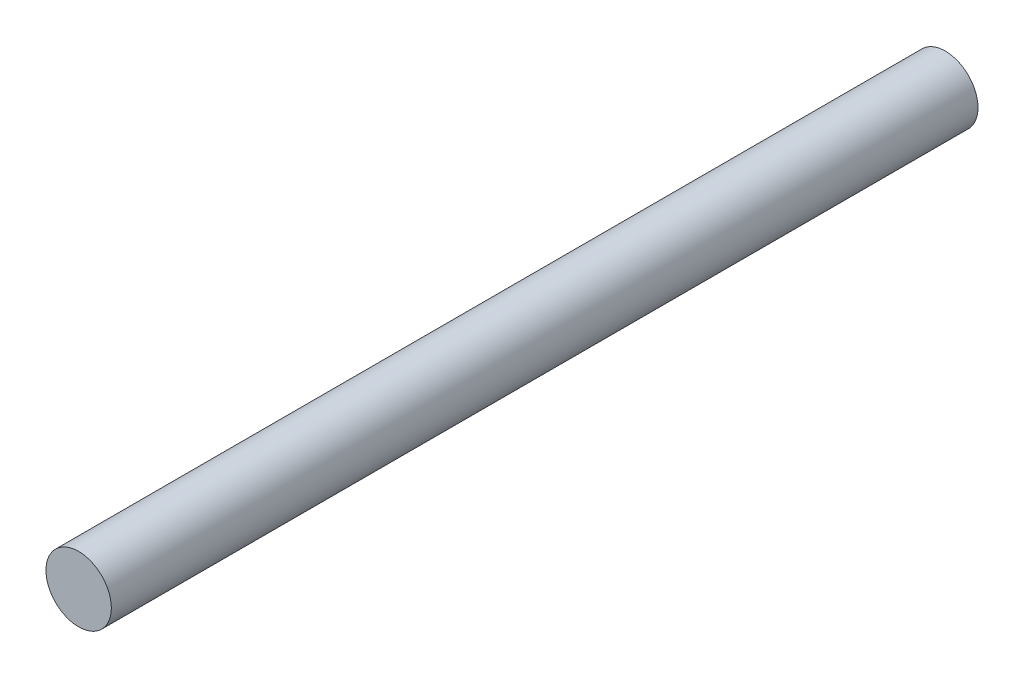
ISO-10303-21;
HEADER;
FILE_DESCRIPTION(('STEP AP214'),'2;1');
FILE_NAME('part.step','',(''),(''),'','','');
FILE_SCHEMA(('AUTOMOTIVE_DESIGN { 1 0 10303 214 1 1 1 1 }'));
ENDSEC;
DATA;
#1=APPLICATION_CONTEXT('core data for automotive mechanical design processes');
#2=APPLICATION_PROTOCOL_DEFINITION('international standard','automotive_design',2000,#1);
#3=PRODUCT_CONTEXT('',#1,'mechanical');
#4=PRODUCT('Part','Part','',(#3));
#5=PRODUCT_RELATED_PRODUCT_CATEGORY('part','',(#4));
#6=PRODUCT_DEFINITION_FORMATION('','',#4);
#7=PRODUCT_DEFINITION_CONTEXT('part definition',#1,'design');
#8=PRODUCT_DEFINITION('design','',#6,#7);
#9=PRODUCT_DEFINITION_SHAPE('','',#8);
#10=(LENGTH_UNIT() NAMED_UNIT(*) SI_UNIT(.MILLI.,.METRE.));
#11=(NAMED_UNIT(*) PLANE_ANGLE_UNIT() SI_UNIT($,.RADIAN.));
#12=(NAMED_UNIT(*) SI_UNIT($,.STERADIAN.) SOLID_ANGLE_UNIT());
#13=UNCERTAINTY_MEASURE_WITH_UNIT(LENGTH_MEASURE(1.E-05),#10,'distance_accuracy_value','');
#14=(GEOMETRIC_REPRESENTATION_CONTEXT(3) GLOBAL_UNCERTAINTY_ASSIGNED_CONTEXT((#13)) GLOBAL_UNIT_ASSIGNED_CONTEXT((#10,
#11,#12)) REPRESENTATION_CONTEXT('',''));
#15=CARTESIAN_POINT('',(0.,0.,0.));
#16=DIRECTION('',(0.,0.,1.));
#17=DIRECTION('',(1.,0.,0.));
#18=AXIS2_PLACEMENT_3D('',#15,#16,#17);
#19=CARTESIAN_POINT('',(0.,0.,106.));
#20=DIRECTION('',(0.,0.,-1.));
#21=DIRECTION('',(-1.,0.,0.));
#22=AXIS2_PLACEMENT_3D('',#19,#20,#21);
#23=CYLINDRICAL_SURFACE('',#22,4.);
#24=CARTESIAN_POINT('',(0.,0.,106.));
#25=DIRECTION('',(0.,0.,1.));
#26=DIRECTION('',(1.,0.,0.));
#27=AXIS2_PLACEMENT_3D('',#24,#25,#26);
#28=CIRCLE('',#27,4.);
#29=CARTESIAN_POINT('',(4.,0.,106.));
#30=VERTEX_POINT('',#29);
#31=EDGE_CURVE('E10',#30,#30,#28,.T.);
#32=ORIENTED_EDGE('',*,*,#31,.F.);
#33=EDGE_LOOP('',(#32));
#34=FACE_BOUND('',#33,.T.);
#35=CARTESIAN_POINT('',(0.,0.,0.));
#36=DIRECTION('',(0.,0.,1.));
#37=DIRECTION('',(1.,0.,0.));
#38=AXIS2_PLACEMENT_3D('',#35,#36,#37);
#39=CIRCLE('',#38,4.);
#40=CARTESIAN_POINT('',(4.,0.,0.));
#41=VERTEX_POINT('',#40);
#42=EDGE_CURVE('E34',#41,#41,#39,.T.);
#43=ORIENTED_EDGE('',*,*,#42,.T.);
#44=EDGE_LOOP('',(#43));
#45=FACE_BOUND('',#44,.T.);
#46=ADVANCED_FACE('F31',(#34,#45),#23,.T.);
#47=CARTESIAN_POINT('',(0.,0.,106.));
#48=DIRECTION('',(0.,0.,1.));
#49=DIRECTION('',(1.,0.,0.));
#50=AXIS2_PLACEMENT_3D('',#47,#48,#49);
#51=PLANE('',#50);
#52=ORIENTED_EDGE('',*,*,#31,.T.);
#53=EDGE_LOOP('',(#52));
#54=FACE_BOUND('',#53,.T.);
#55=ADVANCED_FACE('F46',(#54),#51,.T.);
#56=CARTESIAN_POINT('',(0.,0.,0.));
#57=DIRECTION('',(0.,0.,1.));
#58=DIRECTION('',(1.,0.,0.));
#59=AXIS2_PLACEMENT_3D('',#56,#57,#58);
#60=PLANE('',#59);
#61=ORIENTED_EDGE('',*,*,#42,.F.);
#62=EDGE_LOOP('',(#61));
#63=FACE_BOUND('',#62,.T.);
#64=ADVANCED_FACE('F44',(#63),#60,.F.);
#65=CLOSED_SHELL('',(#46,#55,#64));
#66=MANIFOLD_SOLID_BREP('B2',#65);
#67=ADVANCED_BREP_SHAPE_REPRESENTATION('',(#18,#66),#14);
#68=SHAPE_DEFINITION_REPRESENTATION(#9,#67);
ENDSEC;
END-ISO-10303-21;
